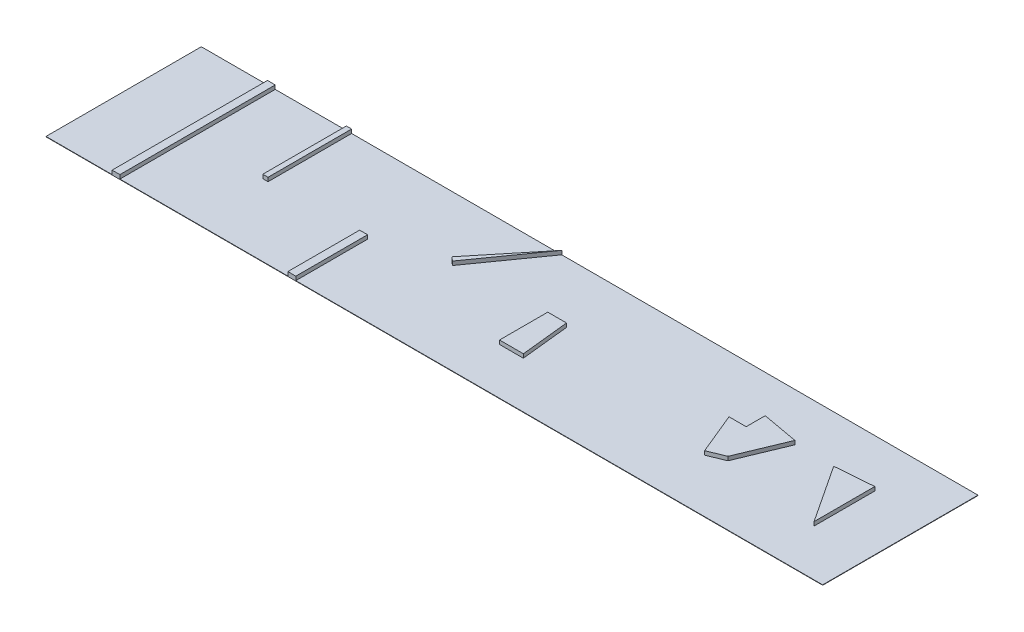
ISO-10303-21;
HEADER;
FILE_DESCRIPTION(('STEP AP214'),'2;1');
FILE_NAME('part.step','',(''),(''),'','','');
FILE_SCHEMA(('AUTOMOTIVE_DESIGN { 1 0 10303 214 1 1 1 1 }'));
ENDSEC;
DATA;
#1=APPLICATION_CONTEXT('core data for automotive mechanical design processes');
#2=APPLICATION_PROTOCOL_DEFINITION('international standard','automotive_design',2000,#1);
#3=PRODUCT_CONTEXT('',#1,'mechanical');
#4=PRODUCT('Part','Part','',(#3));
#5=PRODUCT_RELATED_PRODUCT_CATEGORY('part','',(#4));
#6=PRODUCT_DEFINITION_FORMATION('','',#4);
#7=PRODUCT_DEFINITION_CONTEXT('part definition',#1,'design');
#8=PRODUCT_DEFINITION('design','',#6,#7);
#9=PRODUCT_DEFINITION_SHAPE('','',#8);
#10=(LENGTH_UNIT() NAMED_UNIT(*) SI_UNIT(.MILLI.,.METRE.));
#11=(NAMED_UNIT(*) PLANE_ANGLE_UNIT() SI_UNIT($,.RADIAN.));
#12=(NAMED_UNIT(*) SI_UNIT($,.STERADIAN.) SOLID_ANGLE_UNIT());
#13=UNCERTAINTY_MEASURE_WITH_UNIT(LENGTH_MEASURE(1.E-05),#10,'distance_accuracy_value','');
#14=(GEOMETRIC_REPRESENTATION_CONTEXT(3) GLOBAL_UNCERTAINTY_ASSIGNED_CONTEXT((#13)) GLOBAL_UNIT_ASSIGNED_CONTEXT((#10,
#11,#12)) REPRESENTATION_CONTEXT('',''));
#15=CARTESIAN_POINT('',(0.,0.,0.));
#16=DIRECTION('',(0.,0.,1.));
#17=DIRECTION('',(1.,0.,0.));
#18=AXIS2_PLACEMENT_3D('',#15,#16,#17);
#19=CARTESIAN_POINT('',(0.,5.,0.));
#20=DIRECTION('',(0.,-1.,0.));
#21=DIRECTION('',(0.,0.,-1.));
#22=AXIS2_PLACEMENT_3D('',#19,#20,#21);
#23=PLANE('',#22);
#24=DIRECTION('',(0.,0.,1.));
#25=VECTOR('',#24,1.);
#26=CARTESIAN_POINT('',(7671.56486257291,5.,456.723686309247));
#27=LINE('',#26,#25);
#28=CARTESIAN_POINT('',(7671.56486257291,5.,456.723686309247));
#29=VERTEX_POINT('',#28);
#30=CARTESIAN_POINT('',(7671.56486257291,5.,701.686848023749));
#31=VERTEX_POINT('',#30);
#32=EDGE_CURVE('E260',#29,#31,#27,.T.);
#33=ORIENTED_EDGE('',*,*,#32,.F.);
#34=DIRECTION('',(-0.984268211128272,0.,-0.176680753231217));
#35=VECTOR('',#34,1.);
#36=CARTESIAN_POINT('',(8137.61316567376,5.,540.381539222733));
#37=LINE('',#36,#35);
#38=CARTESIAN_POINT('',(8137.61316567376,5.,540.381539222733));
#39=VERTEX_POINT('',#38);
#40=EDGE_CURVE('E273',#39,#29,#37,.T.);
#41=ORIENTED_EDGE('',*,*,#40,.F.);
#42=DIRECTION('',(0.383817027591733,0.,-0.923409166800204));
#43=VECTOR('',#42,1.);
#44=CARTESIAN_POINT('',(7884.70173577427,5.,1148.85046052906));
#45=LINE('',#44,#43);
#46=CARTESIAN_POINT('',(7884.70173577427,5.,1148.85046052906));
#47=VERTEX_POINT('',#46);
#48=EDGE_CURVE('E292',#47,#39,#45,.T.);
#49=ORIENTED_EDGE('',*,*,#48,.F.);
#50=DIRECTION('',(0.924348506599223,0.,-0.381549260709265));
#51=VECTOR('',#50,1.);
#52=CARTESIAN_POINT('',(7671.56486257291,5.,1236.82833447949));
#53=LINE('',#52,#51);
#54=CARTESIAN_POINT('',(7671.56486257291,5.,1236.82833447949));
#55=VERTEX_POINT('',#54);
#56=EDGE_CURVE('E289',#55,#47,#53,.T.);
#57=ORIENTED_EDGE('',*,*,#56,.F.);
#58=DIRECTION('',(0.381549260709264,0.,0.924348506599223));
#59=VECTOR('',#58,1.);
#60=CARTESIAN_POINT('',(7450.67107946587,5.,701.686848023749));
#61=LINE('',#60,#59);
#62=CARTESIAN_POINT('',(7450.67107946587,5.,701.686848023749));
#63=VERTEX_POINT('',#62);
#64=EDGE_CURVE('E286',#63,#55,#61,.T.);
#65=ORIENTED_EDGE('',*,*,#64,.F.);
#66=DIRECTION('',(-1.,0.,0.));
#67=VECTOR('',#66,1.);
#68=CARTESIAN_POINT('',(7671.56486257291,5.,701.686848023749));
#69=LINE('',#68,#67);
#70=EDGE_CURVE('E263',#31,#63,#69,.T.);
#71=ORIENTED_EDGE('',*,*,#70,.F.);
#72=EDGE_LOOP('',(#33,#41,#49,#57,#65,#71));
#73=FACE_BOUND('',#72,.T.);
#74=DIRECTION('',(0.578892683274416,0.,-0.815403741254201));
#75=VECTOR('',#74,1.);
#76=CARTESIAN_POINT('',(3933.60961483699,5.,745.514979592607));
#77=LINE('',#76,#75);
#78=CARTESIAN_POINT('',(3933.60961483699,5.,745.514979592607));
#79=VERTEX_POINT('',#78);
#80=CARTESIAN_POINT('',(4517.98470242175,5.,-77.6110444177671));
#81=VERTEX_POINT('',#80);
#82=EDGE_CURVE('E347',#79,#81,#77,.T.);
#83=ORIENTED_EDGE('',*,*,#82,.F.);
#84=DIRECTION('',(0.759256602365291,0.,0.650791373455974));
#85=VECTOR('',#84,1.);
#86=CARTESIAN_POINT('',(3882.47679467332,5.,701.686848023749));
#87=LINE('',#86,#85);
#88=CARTESIAN_POINT('',(3882.47679467332,5.,701.686848023749));
#89=VERTEX_POINT('',#88);
#90=EDGE_CURVE('E352',#89,#79,#87,.T.);
#91=ORIENTED_EDGE('',*,*,#90,.F.);
#92=DIRECTION('',(-0.631986335714479,0.,0.774979529710421));
#93=VECTOR('',#92,1.);
#94=CARTESIAN_POINT('',(4517.98470242175,5.,-77.6110444177671));
#95=LINE('',#94,#93);
#96=EDGE_CURVE('E359',#81,#89,#95,.T.);
#97=ORIENTED_EDGE('',*,*,#96,.F.);
#98=DIRECTION('',(-1.,0.,0.));
#99=VECTOR('',#98,1.);
#100=CARTESIAN_POINT('',(-122.80912364946,5.,-77.6110444177671));
#101=LINE('',#100,#99);
#102=CARTESIAN_POINT('',(1812.00339407787,5.,-77.6110444177671));
#103=VERTEX_POINT('',#102);
#104=EDGE_CURVE('E475',#81,#103,#101,.T.);
#105=ORIENTED_EDGE('',*,*,#104,.T.);
#106=DIRECTION('',(0.,0.,-1.));
#107=VECTOR('',#106,1.);
#108=CARTESIAN_POINT('',(1812.00339407787,5.,998.135460163102));
#109=LINE('',#108,#107);
#110=CARTESIAN_POINT('',(1812.00339407787,5.,998.135460163102));
#111=VERTEX_POINT('',#110);
#112=EDGE_CURVE('E407',#111,#103,#109,.T.);
#113=ORIENTED_EDGE('',*,*,#112,.F.);
#114=DIRECTION('',(1.,0.,0.));
#115=VECTOR('',#114,1.);
#116=CARTESIAN_POINT('',(1744.36738857038,5.,998.135460163102));
#117=LINE('',#116,#115);
#118=CARTESIAN_POINT('',(1744.36738857038,5.,998.135460163102));
#119=VERTEX_POINT('',#118);
#120=EDGE_CURVE('E416',#119,#111,#117,.T.);
#121=ORIENTED_EDGE('',*,*,#120,.F.);
#122=DIRECTION('',(0.,0.,1.));
#123=VECTOR('',#122,1.);
#124=CARTESIAN_POINT('',(1744.36738857038,5.,-77.6110444177671));
#125=LINE('',#124,#123);
#126=CARTESIAN_POINT('',(1744.36738857038,5.,-77.6110444177671));
#127=VERTEX_POINT('',#126);
#128=EDGE_CURVE('E402',#127,#119,#125,.T.);
#129=ORIENTED_EDGE('',*,*,#128,.F.);
#130=CARTESIAN_POINT('',(828.754642352808,5.,-77.6110444177671));
#131=VERTEX_POINT('',#130);
#132=EDGE_CURVE('E510',#127,#131,#101,.T.);
#133=ORIENTED_EDGE('',*,*,#132,.T.);
#134=DIRECTION('',(0.,0.,-1.));
#135=VECTOR('',#134,1.);
#136=CARTESIAN_POINT('',(828.754642352808,5.,1922.38895558223));
#137=LINE('',#136,#135);
#138=CARTESIAN_POINT('',(828.754642352808,5.,1922.38895558223));
#139=VERTEX_POINT('',#138);
#140=EDGE_CURVE('E437',#139,#131,#137,.T.);
#141=ORIENTED_EDGE('',*,*,#140,.F.);
#142=DIRECTION('',(1.,0.,0.));
#143=VECTOR('',#142,1.);
#144=CARTESIAN_POINT('',(-122.80912364946,5.,1922.38895558223));
#145=LINE('',#144,#143);
#146=CARTESIAN_POINT('',(2991.30478610656,5.,1922.38895558223));
#147=VERTEX_POINT('',#146);
#148=EDGE_CURVE('E468',#139,#147,#145,.T.);
#149=ORIENTED_EDGE('',*,*,#148,.T.);
#150=DIRECTION('',(0.,0.,1.));
#151=VECTOR('',#150,1.);
#152=CARTESIAN_POINT('',(2991.30478610656,5.,1922.38895558223));
#153=LINE('',#152,#151);
#154=CARTESIAN_POINT('',(2991.30478610656,5.,998.135460163102));
#155=VERTEX_POINT('',#154);
#156=EDGE_CURVE('E377',#155,#147,#153,.T.);
#157=ORIENTED_EDGE('',*,*,#156,.F.);
#158=DIRECTION('',(-1.,0.,0.));
#159=VECTOR('',#158,1.);
#160=CARTESIAN_POINT('',(2991.30478610656,5.,998.135460163102));
#161=LINE('',#160,#159);
#162=CARTESIAN_POINT('',(3093.5704264339,5.,998.135460163102));
#163=VERTEX_POINT('',#162);
#164=EDGE_CURVE('E386',#163,#155,#161,.T.);
#165=ORIENTED_EDGE('',*,*,#164,.F.);
#166=DIRECTION('',(0.,0.,-1.));
#167=VECTOR('',#166,1.);
#168=CARTESIAN_POINT('',(3093.5704264339,5.,998.135460163102));
#169=LINE('',#168,#167);
#170=CARTESIAN_POINT('',(3093.5704264339,5.,1922.38895558223));
#171=VERTEX_POINT('',#170);
#172=EDGE_CURVE('E372',#171,#163,#169,.T.);
#173=ORIENTED_EDGE('',*,*,#172,.F.);
#174=CARTESIAN_POINT('',(9877.19087635054,5.,1922.38895558223));
#175=VERTEX_POINT('',#174);
#176=EDGE_CURVE('E463',#171,#175,#145,.T.);
#177=ORIENTED_EDGE('',*,*,#176,.T.);
#178=DIRECTION('',(0.,0.,-1.));
#179=VECTOR('',#178,1.);
#180=CARTESIAN_POINT('',(9877.19087635054,5.,1922.38895558223));
#181=LINE('',#180,#179);
#182=CARTESIAN_POINT('',(9877.19087635054,5.,-77.6110444177671));
#183=VERTEX_POINT('',#182);
#184=EDGE_CURVE('E467',#175,#183,#181,.T.);
#185=ORIENTED_EDGE('',*,*,#184,.T.);
#186=EDGE_CURVE('E471',#183,#81,#101,.T.);
#187=ORIENTED_EDGE('',*,*,#186,.T.);
#188=EDGE_LOOP('',(#83,#91,#97,#105,#113,#121,#129,#133,#141,#149,#157,#165,#173,#177,#185,#187));
#189=FACE_BOUND('',#188,.T.);
#190=DIRECTION('',(-0.105293769951943,0.,-0.994441160657234));
#191=VECTOR('',#190,1.);
#192=CARTESIAN_POINT('',(5423.76608817813,5.,1322.58537858256));
#193=LINE('',#192,#191);
#194=CARTESIAN_POINT('',(5423.76608817813,5.,1322.58537858256));
#195=VERTEX_POINT('',#194);
#196=CARTESIAN_POINT('',(5358.02389082484,5.,701.686848023749));
#197=VERTEX_POINT('',#196);
#198=EDGE_CURVE('E314',#195,#197,#193,.T.);
#199=ORIENTED_EDGE('',*,*,#198,.F.);
#200=DIRECTION('',(1.,0.,0.));
#201=VECTOR('',#200,1.);
#202=CARTESIAN_POINT('',(5116.96916719613,5.,1322.58537858256));
#203=LINE('',#202,#201);
#204=CARTESIAN_POINT('',(5116.96916719613,5.,1322.58537858256));
#205=VERTEX_POINT('',#204);
#206=EDGE_CURVE('E319',#205,#195,#203,.T.);
#207=ORIENTED_EDGE('',*,*,#206,.F.);
#208=DIRECTION('',(0.,0.,1.));
#209=VECTOR('',#208,1.);
#210=CARTESIAN_POINT('',(5116.96916719613,5.,701.686848023749));
#211=LINE('',#210,#209);
#212=CARTESIAN_POINT('',(5116.96916719613,5.,701.686848023749));
#213=VERTEX_POINT('',#212);
#214=EDGE_CURVE('E331',#213,#205,#211,.T.);
#215=ORIENTED_EDGE('',*,*,#214,.F.);
#216=DIRECTION('',(-1.,0.,0.));
#217=VECTOR('',#216,1.);
#218=CARTESIAN_POINT('',(5358.02389082484,5.,701.686848023749));
#219=LINE('',#218,#217);
#220=EDGE_CURVE('E328',#197,#213,#219,.T.);
#221=ORIENTED_EDGE('',*,*,#220,.F.);
#222=EDGE_LOOP('',(#199,#207,#215,#221));
#223=FACE_BOUND('',#222,.T.);
#224=DIRECTION('',(-0.996885499085346,0.,0.078862549498226));
#225=VECTOR('',#224,1.);
#226=CARTESIAN_POINT('',(8675.89526309959,5.,579.205267166498));
#227=LINE('',#226,#225);
#228=CARTESIAN_POINT('',(9166.65813665397,5.,540.381539222733));
#229=VERTEX_POINT('',#228);
#230=CARTESIAN_POINT('',(8675.89526309959,5.,579.205267166499));
#231=VERTEX_POINT('',#230);
#232=EDGE_CURVE('E259',#229,#231,#227,.T.);
#233=ORIENTED_EDGE('',*,*,#232,.F.);
#234=DIRECTION('',(0.,0.,-1.));
#235=VECTOR('',#234,1.);
#236=CARTESIAN_POINT('',(9166.65813665397,5.,540.381539222733));
#237=LINE('',#236,#235);
#238=CARTESIAN_POINT('',(9166.65813665397,5.,1322.58537858256));
#239=VERTEX_POINT('',#238);
#240=EDGE_CURVE('E52',#239,#229,#237,.T.);
#241=ORIENTED_EDGE('',*,*,#240,.F.);
#242=DIRECTION('',(0.550945427344042,0.,0.834541272849157));
#243=VECTOR('',#242,1.);
#244=CARTESIAN_POINT('',(9166.65813665397,5.,1322.58537858256));
#245=LINE('',#244,#243);
#246=EDGE_CURVE('E48',#231,#239,#245,.T.);
#247=ORIENTED_EDGE('',*,*,#246,.F.);
#248=EDGE_LOOP('',(#233,#241,#247));
#249=FACE_BOUND('',#248,.T.);
#250=ADVANCED_FACE('F33',(#73,#189,#223,#249),#23,.F.);
#251=DIRECTION('',(0.,0.,1.));
#252=VECTOR('',#251,1.);
#253=CARTESIAN_POINT('',(728.754642352808,5.,-77.6110444177671));
#254=LINE('',#253,#252);
#255=CARTESIAN_POINT('',(728.754642352808,5.,-77.6110444177671));
#256=VERTEX_POINT('',#255);
#257=CARTESIAN_POINT('',(728.754642352808,5.,1922.38895558223));
#258=VERTEX_POINT('',#257);
#259=EDGE_CURVE('E432',#256,#258,#254,.T.);
#260=ORIENTED_EDGE('',*,*,#259,.F.);
#261=CARTESIAN_POINT('',(-122.80912364946,5.,-77.6110444177671));
#262=VERTEX_POINT('',#261);
#263=EDGE_CURVE('E470',#256,#262,#101,.T.);
#264=ORIENTED_EDGE('',*,*,#263,.T.);
#265=DIRECTION('',(0.,0.,1.));
#266=VECTOR('',#265,1.);
#267=CARTESIAN_POINT('',(-122.80912364946,5.,1922.38895558223));
#268=LINE('',#267,#266);
#269=CARTESIAN_POINT('',(-122.80912364946,5.,1922.38895558223));
#270=VERTEX_POINT('',#269);
#271=EDGE_CURVE('E460',#262,#270,#268,.T.);
#272=ORIENTED_EDGE('',*,*,#271,.T.);
#273=EDGE_CURVE('E465',#270,#258,#145,.T.);
#274=ORIENTED_EDGE('',*,*,#273,.T.);
#275=EDGE_LOOP('',(#260,#264,#272,#274));
#276=FACE_BOUND('',#275,.T.);
#277=ADVANCED_FACE('F508',(#276),#23,.F.);
#278=CARTESIAN_POINT('',(-122.80912364946,5.,1922.38895558223));
#279=DIRECTION('',(1.,0.,0.));
#280=DIRECTION('',(0.,0.,-1.));
#281=AXIS2_PLACEMENT_3D('',#278,#279,#280);
#282=PLANE('',#281);
#283=DIRECTION('',(0.,0.,1.));
#284=VECTOR('',#283,1.);
#285=CARTESIAN_POINT('',(-122.80912364946,0.,1922.38895558223));
#286=LINE('',#285,#284);
#287=CARTESIAN_POINT('',(-122.80912364946,0.,-77.6110444177671));
#288=VERTEX_POINT('',#287);
#289=CARTESIAN_POINT('',(-122.80912364946,0.,1922.38895558223));
#290=VERTEX_POINT('',#289);
#291=EDGE_CURVE('E459',#288,#290,#286,.T.);
#292=ORIENTED_EDGE('',*,*,#291,.T.);
#293=DIRECTION('',(0.,-1.,0.));
#294=VECTOR('',#293,1.);
#295=CARTESIAN_POINT('',(-122.80912364946,5.,1922.38895558223));
#296=LINE('',#295,#294);
#297=EDGE_CURVE('E11',#270,#290,#296,.T.);
#298=ORIENTED_EDGE('',*,*,#297,.F.);
#299=ORIENTED_EDGE('',*,*,#271,.F.);
#300=DIRECTION('',(0.,-1.,0.));
#301=VECTOR('',#300,1.);
#302=CARTESIAN_POINT('',(-122.80912364946,5.,-77.6110444177671));
#303=LINE('',#302,#301);
#304=EDGE_CURVE('E474',#262,#288,#303,.T.);
#305=ORIENTED_EDGE('',*,*,#304,.T.);
#306=EDGE_LOOP('',(#292,#298,#299,#305));
#307=FACE_BOUND('',#306,.T.);
#308=ADVANCED_FACE('F35',(#307),#282,.F.);
#309=CARTESIAN_POINT('',(-122.80912364946,5.,1922.38895558223));
#310=DIRECTION('',(0.,0.,-1.));
#311=DIRECTION('',(-1.,0.,0.));
#312=AXIS2_PLACEMENT_3D('',#309,#310,#311);
#313=PLANE('',#312);
#314=DIRECTION('',(1.,0.,0.));
#315=VECTOR('',#314,1.);
#316=CARTESIAN_POINT('',(-122.80912364946,0.,1922.38895558223));
#317=LINE('',#316,#315);
#318=CARTESIAN_POINT('',(9877.19087635054,0.,1922.38895558223));
#319=VERTEX_POINT('',#318);
#320=EDGE_CURVE('E478',#290,#319,#317,.T.);
#321=ORIENTED_EDGE('',*,*,#320,.T.);
#322=DIRECTION('',(0.,-1.,0.));
#323=VECTOR('',#322,1.);
#324=CARTESIAN_POINT('',(9877.19087635054,5.,1922.38895558223));
#325=LINE('',#324,#323);
#326=EDGE_CURVE('E41',#175,#319,#325,.T.);
#327=ORIENTED_EDGE('',*,*,#326,.F.);
#328=ORIENTED_EDGE('',*,*,#176,.F.);
#329=DIRECTION('',(0.,-1.,0.));
#330=VECTOR('',#329,1.);
#331=CARTESIAN_POINT('',(3093.5704264339,55.,1922.38895558223));
#332=LINE('',#331,#330);
#333=CARTESIAN_POINT('',(3093.5704264339,55.,1922.38895558223));
#334=VERTEX_POINT('',#333);
#335=EDGE_CURVE('E399',#334,#171,#332,.T.);
#336=ORIENTED_EDGE('',*,*,#335,.F.);
#337=DIRECTION('',(1.,0.,0.));
#338=VECTOR('',#337,1.);
#339=CARTESIAN_POINT('',(3093.5704264339,55.,1922.38895558223));
#340=LINE('',#339,#338);
#341=CARTESIAN_POINT('',(2991.30478610656,55.,1922.38895558223));
#342=VERTEX_POINT('',#341);
#343=EDGE_CURVE('E373',#342,#334,#340,.T.);
#344=ORIENTED_EDGE('',*,*,#343,.F.);
#345=DIRECTION('',(0.,-1.,0.));
#346=VECTOR('',#345,1.);
#347=CARTESIAN_POINT('',(2991.30478610656,55.,1922.38895558223));
#348=LINE('',#347,#346);
#349=EDGE_CURVE('E383',#342,#147,#348,.T.);
#350=ORIENTED_EDGE('',*,*,#349,.T.);
#351=ORIENTED_EDGE('',*,*,#148,.F.);
#352=DIRECTION('',(0.,-1.,0.));
#353=VECTOR('',#352,1.);
#354=CARTESIAN_POINT('',(828.754642352808,55.,1922.38895558223));
#355=LINE('',#354,#353);
#356=CARTESIAN_POINT('',(828.754642352808,55.,1922.38895558223));
#357=VERTEX_POINT('',#356);
#358=EDGE_CURVE('E450',#357,#139,#355,.T.);
#359=ORIENTED_EDGE('',*,*,#358,.F.);
#360=DIRECTION('',(1.,0.,0.));
#361=VECTOR('',#360,1.);
#362=CARTESIAN_POINT('',(728.754642352808,55.,1922.38895558223));
#363=LINE('',#362,#361);
#364=CARTESIAN_POINT('',(728.754642352808,55.,1922.38895558223));
#365=VERTEX_POINT('',#364);
#366=EDGE_CURVE('E439',#365,#357,#363,.T.);
#367=ORIENTED_EDGE('',*,*,#366,.F.);
#368=DIRECTION('',(0.,-1.,0.));
#369=VECTOR('',#368,1.);
#370=CARTESIAN_POINT('',(728.754642352808,55.,1922.38895558223));
#371=LINE('',#370,#369);
#372=EDGE_CURVE('E453',#365,#258,#371,.T.);
#373=ORIENTED_EDGE('',*,*,#372,.T.);
#374=ORIENTED_EDGE('',*,*,#273,.F.);
#375=ORIENTED_EDGE('',*,*,#297,.T.);
#376=EDGE_LOOP('',(#321,#327,#328,#336,#344,#350,#351,#359,#367,#373,#374,#375));
#377=FACE_BOUND('',#376,.T.);
#378=ADVANCED_FACE('F556',(#377),#313,.F.);
#379=CARTESIAN_POINT('',(9877.19087635054,5.,1922.38895558223));
#380=DIRECTION('',(-1.,0.,0.));
#381=DIRECTION('',(0.,0.,1.));
#382=AXIS2_PLACEMENT_3D('',#379,#380,#381);
#383=PLANE('',#382);
#384=DIRECTION('',(0.,0.,-1.));
#385=VECTOR('',#384,1.);
#386=CARTESIAN_POINT('',(9877.19087635054,0.,1922.38895558223));
#387=LINE('',#386,#385);
#388=CARTESIAN_POINT('',(9877.19087635054,0.,-77.6110444177671));
#389=VERTEX_POINT('',#388);
#390=EDGE_CURVE('E480',#319,#389,#387,.T.);
#391=ORIENTED_EDGE('',*,*,#390,.T.);
#392=DIRECTION('',(0.,-1.,0.));
#393=VECTOR('',#392,1.);
#394=CARTESIAN_POINT('',(9877.19087635054,5.,-77.6110444177671));
#395=LINE('',#394,#393);
#396=EDGE_CURVE('E485',#183,#389,#395,.T.);
#397=ORIENTED_EDGE('',*,*,#396,.F.);
#398=ORIENTED_EDGE('',*,*,#184,.F.);
#399=ORIENTED_EDGE('',*,*,#326,.T.);
#400=EDGE_LOOP('',(#391,#397,#398,#399));
#401=FACE_BOUND('',#400,.T.);
#402=ADVANCED_FACE('F492',(#401),#383,.F.);
#403=CARTESIAN_POINT('',(-122.80912364946,5.,-77.6110444177671));
#404=DIRECTION('',(0.,0.,1.));
#405=DIRECTION('',(1.,0.,0.));
#406=AXIS2_PLACEMENT_3D('',#403,#404,#405);
#407=PLANE('',#406);
#408=DIRECTION('',(-1.,0.,0.));
#409=VECTOR('',#408,1.);
#410=CARTESIAN_POINT('',(-122.80912364946,0.,-77.6110444177671));
#411=LINE('',#410,#409);
#412=EDGE_CURVE('E464',#389,#288,#411,.T.);
#413=ORIENTED_EDGE('',*,*,#412,.T.);
#414=ORIENTED_EDGE('',*,*,#304,.F.);
#415=ORIENTED_EDGE('',*,*,#263,.F.);
#416=DIRECTION('',(0.,-1.,0.));
#417=VECTOR('',#416,1.);
#418=CARTESIAN_POINT('',(728.754642352808,55.,-77.6110444177671));
#419=LINE('',#418,#417);
#420=CARTESIAN_POINT('',(728.754642352808,55.,-77.6110444177671));
#421=VERTEX_POINT('',#420);
#422=EDGE_CURVE('E456',#421,#256,#419,.T.);
#423=ORIENTED_EDGE('',*,*,#422,.F.);
#424=DIRECTION('',(-1.,0.,0.));
#425=VECTOR('',#424,1.);
#426=CARTESIAN_POINT('',(828.754642352808,55.,-77.6110444177671));
#427=LINE('',#426,#425);
#428=CARTESIAN_POINT('',(828.754642352808,55.,-77.6110444177671));
#429=VERTEX_POINT('',#428);
#430=EDGE_CURVE('E433',#429,#421,#427,.T.);
#431=ORIENTED_EDGE('',*,*,#430,.F.);
#432=DIRECTION('',(0.,-1.,0.));
#433=VECTOR('',#432,1.);
#434=CARTESIAN_POINT('',(828.754642352808,55.,-77.6110444177671));
#435=LINE('',#434,#433);
#436=EDGE_CURVE('E443',#429,#131,#435,.T.);
#437=ORIENTED_EDGE('',*,*,#436,.T.);
#438=ORIENTED_EDGE('',*,*,#132,.F.);
#439=DIRECTION('',(0.,-1.,0.));
#440=VECTOR('',#439,1.);
#441=CARTESIAN_POINT('',(1744.36738857038,55.,-77.6110444177671));
#442=LINE('',#441,#440);
#443=CARTESIAN_POINT('',(1744.36738857038,55.,-77.6110444177671));
#444=VERTEX_POINT('',#443);
#445=EDGE_CURVE('E429',#444,#127,#442,.T.);
#446=ORIENTED_EDGE('',*,*,#445,.F.);
#447=DIRECTION('',(-1.,0.,0.));
#448=VECTOR('',#447,1.);
#449=CARTESIAN_POINT('',(1812.00339407787,55.,-77.6110444177671));
#450=LINE('',#449,#448);
#451=CARTESIAN_POINT('',(1812.00339407787,55.,-77.6110444177671));
#452=VERTEX_POINT('',#451);
#453=EDGE_CURVE('E403',#452,#444,#450,.T.);
#454=ORIENTED_EDGE('',*,*,#453,.F.);
#455=DIRECTION('',(0.,-1.,0.));
#456=VECTOR('',#455,1.);
#457=CARTESIAN_POINT('',(1812.00339407787,55.,-77.6110444177671));
#458=LINE('',#457,#456);
#459=EDGE_CURVE('E413',#452,#103,#458,.T.);
#460=ORIENTED_EDGE('',*,*,#459,.T.);
#461=ORIENTED_EDGE('',*,*,#104,.F.);
#462=ORIENTED_EDGE('',*,*,#186,.F.);
#463=ORIENTED_EDGE('',*,*,#396,.T.);
#464=EDGE_LOOP('',(#413,#414,#415,#423,#431,#437,#438,#446,#454,#460,#461,#462,#463));
#465=FACE_BOUND('',#464,.T.);
#466=ADVANCED_FACE('F501',(#465),#407,.F.);
#467=CARTESIAN_POINT('',(0.,0.,0.));
#468=DIRECTION('',(0.,-1.,0.));
#469=DIRECTION('',(0.,0.,-1.));
#470=AXIS2_PLACEMENT_3D('',#467,#468,#469);
#471=PLANE('',#470);
#472=ORIENTED_EDGE('',*,*,#291,.F.);
#473=ORIENTED_EDGE('',*,*,#412,.F.);
#474=ORIENTED_EDGE('',*,*,#390,.F.);
#475=ORIENTED_EDGE('',*,*,#320,.F.);
#476=EDGE_LOOP('',(#472,#473,#474,#475));
#477=FACE_BOUND('',#476,.T.);
#478=ADVANCED_FACE('F498',(#477),#471,.T.);
#479=CARTESIAN_POINT('',(728.754642352808,55.,-77.6110444177671));
#480=DIRECTION('',(1.,0.,0.));
#481=DIRECTION('',(0.,0.,-1.));
#482=AXIS2_PLACEMENT_3D('',#479,#480,#481);
#483=PLANE('',#482);
#484=ORIENTED_EDGE('',*,*,#259,.T.);
#485=ORIENTED_EDGE('',*,*,#372,.F.);
#486=DIRECTION('',(0.,0.,1.));
#487=VECTOR('',#486,1.);
#488=CARTESIAN_POINT('',(728.754642352808,55.,-77.6110444177671));
#489=LINE('',#488,#487);
#490=EDGE_CURVE('E436',#421,#365,#489,.T.);
#491=ORIENTED_EDGE('',*,*,#490,.F.);
#492=ORIENTED_EDGE('',*,*,#422,.T.);
#493=EDGE_LOOP('',(#484,#485,#491,#492));
#494=FACE_BOUND('',#493,.T.);
#495=ADVANCED_FACE('F549',(#494),#483,.F.);
#496=CARTESIAN_POINT('',(828.754642352808,55.,1922.38895558223));
#497=DIRECTION('',(-1.,0.,0.));
#498=DIRECTION('',(0.,0.,1.));
#499=AXIS2_PLACEMENT_3D('',#496,#497,#498);
#500=PLANE('',#499);
#501=ORIENTED_EDGE('',*,*,#140,.T.);
#502=ORIENTED_EDGE('',*,*,#436,.F.);
#503=DIRECTION('',(0.,0.,-1.));
#504=VECTOR('',#503,1.);
#505=CARTESIAN_POINT('',(828.754642352808,55.,1922.38895558223));
#506=LINE('',#505,#504);
#507=EDGE_CURVE('E441',#357,#429,#506,.T.);
#508=ORIENTED_EDGE('',*,*,#507,.F.);
#509=ORIENTED_EDGE('',*,*,#358,.T.);
#510=EDGE_LOOP('',(#501,#502,#508,#509));
#511=FACE_BOUND('',#510,.T.);
#512=ADVANCED_FACE('F538',(#511),#500,.F.);
#513=CARTESIAN_POINT('',(0.,55.,0.));
#514=DIRECTION('',(0.,1.,0.));
#515=DIRECTION('',(0.,0.,1.));
#516=AXIS2_PLACEMENT_3D('',#513,#514,#515);
#517=PLANE('',#516);
#518=ORIENTED_EDGE('',*,*,#430,.T.);
#519=ORIENTED_EDGE('',*,*,#490,.T.);
#520=ORIENTED_EDGE('',*,*,#366,.T.);
#521=ORIENTED_EDGE('',*,*,#507,.T.);
#522=EDGE_LOOP('',(#518,#519,#520,#521));
#523=FACE_BOUND('',#522,.T.);
#524=ADVANCED_FACE('F531',(#523),#517,.T.);
#525=CARTESIAN_POINT('',(1744.36738857038,55.,-77.6110444177671));
#526=DIRECTION('',(1.,0.,0.));
#527=DIRECTION('',(0.,0.,-1.));
#528=AXIS2_PLACEMENT_3D('',#525,#526,#527);
#529=PLANE('',#528);
#530=ORIENTED_EDGE('',*,*,#128,.T.);
#531=DIRECTION('',(0.,-1.,0.));
#532=VECTOR('',#531,1.);
#533=CARTESIAN_POINT('',(1744.36738857038,55.,998.135460163102));
#534=LINE('',#533,#532);
#535=CARTESIAN_POINT('',(1744.36738857038,55.,998.135460163102));
#536=VERTEX_POINT('',#535);
#537=EDGE_CURVE('E426',#536,#119,#534,.T.);
#538=ORIENTED_EDGE('',*,*,#537,.F.);
#539=DIRECTION('',(0.,0.,1.));
#540=VECTOR('',#539,1.);
#541=CARTESIAN_POINT('',(1744.36738857038,55.,-77.6110444177671));
#542=LINE('',#541,#540);
#543=EDGE_CURVE('E406',#444,#536,#542,.T.);
#544=ORIENTED_EDGE('',*,*,#543,.F.);
#545=ORIENTED_EDGE('',*,*,#445,.T.);
#546=EDGE_LOOP('',(#530,#538,#544,#545));
#547=FACE_BOUND('',#546,.T.);
#548=ADVANCED_FACE('F529',(#547),#529,.F.);
#549=CARTESIAN_POINT('',(1744.36738857038,55.,998.135460163102));
#550=DIRECTION('',(0.,0.,-1.));
#551=DIRECTION('',(-1.,0.,0.));
#552=AXIS2_PLACEMENT_3D('',#549,#550,#551);
#553=PLANE('',#552);
#554=ORIENTED_EDGE('',*,*,#120,.T.);
#555=DIRECTION('',(0.,-1.,0.));
#556=VECTOR('',#555,1.);
#557=CARTESIAN_POINT('',(1812.00339407787,55.,998.135460163102));
#558=LINE('',#557,#556);
#559=CARTESIAN_POINT('',(1812.00339407787,55.,998.135460163102));
#560=VERTEX_POINT('',#559);
#561=EDGE_CURVE('E423',#560,#111,#558,.T.);
#562=ORIENTED_EDGE('',*,*,#561,.F.);
#563=DIRECTION('',(1.,0.,0.));
#564=VECTOR('',#563,1.);
#565=CARTESIAN_POINT('',(1744.36738857038,55.,998.135460163102));
#566=LINE('',#565,#564);
#567=EDGE_CURVE('E409',#536,#560,#566,.T.);
#568=ORIENTED_EDGE('',*,*,#567,.F.);
#569=ORIENTED_EDGE('',*,*,#537,.T.);
#570=EDGE_LOOP('',(#554,#562,#568,#569));
#571=FACE_BOUND('',#570,.T.);
#572=ADVANCED_FACE('F527',(#571),#553,.F.);
#573=CARTESIAN_POINT('',(1812.00339407787,55.,998.135460163102));
#574=DIRECTION('',(-1.,0.,0.));
#575=DIRECTION('',(0.,0.,1.));
#576=AXIS2_PLACEMENT_3D('',#573,#574,#575);
#577=PLANE('',#576);
#578=ORIENTED_EDGE('',*,*,#112,.T.);
#579=ORIENTED_EDGE('',*,*,#459,.F.);
#580=DIRECTION('',(0.,0.,-1.));
#581=VECTOR('',#580,1.);
#582=CARTESIAN_POINT('',(1812.00339407787,55.,998.135460163102));
#583=LINE('',#582,#581);
#584=EDGE_CURVE('E411',#560,#452,#583,.T.);
#585=ORIENTED_EDGE('',*,*,#584,.F.);
#586=ORIENTED_EDGE('',*,*,#561,.T.);
#587=EDGE_LOOP('',(#578,#579,#585,#586));
#588=FACE_BOUND('',#587,.T.);
#589=ADVANCED_FACE('F517',(#588),#577,.F.);
#590=CARTESIAN_POINT('',(0.,55.,0.));
#591=DIRECTION('',(0.,1.,0.));
#592=DIRECTION('',(0.,0.,1.));
#593=AXIS2_PLACEMENT_3D('',#590,#591,#592);
#594=PLANE('',#593);
#595=ORIENTED_EDGE('',*,*,#453,.T.);
#596=ORIENTED_EDGE('',*,*,#543,.T.);
#597=ORIENTED_EDGE('',*,*,#567,.T.);
#598=ORIENTED_EDGE('',*,*,#584,.T.);
#599=EDGE_LOOP('',(#595,#596,#597,#598));
#600=FACE_BOUND('',#599,.T.);
#601=ADVANCED_FACE('F523',(#600),#594,.T.);
#602=CARTESIAN_POINT('',(3093.5704264339,55.,998.135460163102));
#603=DIRECTION('',(-1.,0.,0.));
#604=DIRECTION('',(0.,0.,1.));
#605=AXIS2_PLACEMENT_3D('',#602,#603,#604);
#606=PLANE('',#605);
#607=ORIENTED_EDGE('',*,*,#172,.T.);
#608=DIRECTION('',(0.,-1.,0.));
#609=VECTOR('',#608,1.);
#610=CARTESIAN_POINT('',(3093.5704264339,55.,998.135460163102));
#611=LINE('',#610,#609);
#612=CARTESIAN_POINT('',(3093.5704264339,55.,998.135460163102));
#613=VERTEX_POINT('',#612);
#614=EDGE_CURVE('E396',#613,#163,#611,.T.);
#615=ORIENTED_EDGE('',*,*,#614,.F.);
#616=DIRECTION('',(0.,0.,-1.));
#617=VECTOR('',#616,1.);
#618=CARTESIAN_POINT('',(3093.5704264339,55.,998.135460163102));
#619=LINE('',#618,#617);
#620=EDGE_CURVE('E376',#334,#613,#619,.T.);
#621=ORIENTED_EDGE('',*,*,#620,.F.);
#622=ORIENTED_EDGE('',*,*,#335,.T.);
#623=EDGE_LOOP('',(#607,#615,#621,#622));
#624=FACE_BOUND('',#623,.T.);
#625=ADVANCED_FACE('F575',(#624),#606,.F.);
#626=CARTESIAN_POINT('',(2991.30478610656,55.,998.135460163102));
#627=DIRECTION('',(0.,0.,1.));
#628=DIRECTION('',(1.,0.,0.));
#629=AXIS2_PLACEMENT_3D('',#626,#627,#628);
#630=PLANE('',#629);
#631=ORIENTED_EDGE('',*,*,#164,.T.);
#632=DIRECTION('',(0.,-1.,0.));
#633=VECTOR('',#632,1.);
#634=CARTESIAN_POINT('',(2991.30478610656,55.,998.135460163102));
#635=LINE('',#634,#633);
#636=CARTESIAN_POINT('',(2991.30478610656,55.,998.135460163102));
#637=VERTEX_POINT('',#636);
#638=EDGE_CURVE('E393',#637,#155,#635,.T.);
#639=ORIENTED_EDGE('',*,*,#638,.F.);
#640=DIRECTION('',(-1.,0.,0.));
#641=VECTOR('',#640,1.);
#642=CARTESIAN_POINT('',(2991.30478610656,55.,998.135460163102));
#643=LINE('',#642,#641);
#644=EDGE_CURVE('E379',#613,#637,#643,.T.);
#645=ORIENTED_EDGE('',*,*,#644,.F.);
#646=ORIENTED_EDGE('',*,*,#614,.T.);
#647=EDGE_LOOP('',(#631,#639,#645,#646));
#648=FACE_BOUND('',#647,.T.);
#649=ADVANCED_FACE('F585',(#648),#630,.F.);
#650=CARTESIAN_POINT('',(2991.30478610656,55.,1922.38895558223));
#651=DIRECTION('',(1.,0.,0.));
#652=DIRECTION('',(0.,0.,-1.));
#653=AXIS2_PLACEMENT_3D('',#650,#651,#652);
#654=PLANE('',#653);
#655=ORIENTED_EDGE('',*,*,#156,.T.);
#656=ORIENTED_EDGE('',*,*,#349,.F.);
#657=DIRECTION('',(0.,0.,1.));
#658=VECTOR('',#657,1.);
#659=CARTESIAN_POINT('',(2991.30478610656,55.,1922.38895558223));
#660=LINE('',#659,#658);
#661=EDGE_CURVE('E381',#637,#342,#660,.T.);
#662=ORIENTED_EDGE('',*,*,#661,.F.);
#663=ORIENTED_EDGE('',*,*,#638,.T.);
#664=EDGE_LOOP('',(#655,#656,#662,#663));
#665=FACE_BOUND('',#664,.T.);
#666=ADVANCED_FACE('F583',(#665),#654,.F.);
#667=CARTESIAN_POINT('',(0.,55.,0.));
#668=DIRECTION('',(0.,-1.,0.));
#669=DIRECTION('',(0.,0.,-1.));
#670=AXIS2_PLACEMENT_3D('',#667,#668,#669);
#671=PLANE('',#670);
#672=ORIENTED_EDGE('',*,*,#343,.T.);
#673=ORIENTED_EDGE('',*,*,#620,.T.);
#674=ORIENTED_EDGE('',*,*,#644,.T.);
#675=ORIENTED_EDGE('',*,*,#661,.T.);
#676=EDGE_LOOP('',(#672,#673,#674,#675));
#677=FACE_BOUND('',#676,.T.);
#678=ADVANCED_FACE('F579',(#677),#671,.F.);
#679=CARTESIAN_POINT('',(3933.60961483699,55.,745.514979592607));
#680=DIRECTION('',(-0.815403741254201,0.,-0.578892683274416));
#681=DIRECTION('',(-0.578892683274416,0.,0.815403741254201));
#682=AXIS2_PLACEMENT_3D('',#679,#680,#681);
#683=PLANE('',#682);
#684=ORIENTED_EDGE('',*,*,#82,.T.);
#685=DIRECTION('',(0.,-1.,0.));
#686=VECTOR('',#685,1.);
#687=CARTESIAN_POINT('',(4517.98470242175,55.,-77.6110444177671));
#688=LINE('',#687,#686);
#689=CARTESIAN_POINT('',(4517.98470242175,55.,-77.6110444177671));
#690=VERTEX_POINT('',#689);
#691=EDGE_CURVE('E369',#690,#81,#688,.T.);
#692=ORIENTED_EDGE('',*,*,#691,.F.);
#693=DIRECTION('',(0.578892683274416,0.,-0.815403741254201));
#694=VECTOR('',#693,1.);
#695=CARTESIAN_POINT('',(3933.60961483699,55.,745.514979592607));
#696=LINE('',#695,#694);
#697=CARTESIAN_POINT('',(3933.60961483699,55.,745.514979592607));
#698=VERTEX_POINT('',#697);
#699=EDGE_CURVE('E348',#698,#690,#696,.T.);
#700=ORIENTED_EDGE('',*,*,#699,.F.);
#701=DIRECTION('',(0.,-1.,0.));
#702=VECTOR('',#701,1.);
#703=CARTESIAN_POINT('',(3933.60961483699,55.,745.514979592607));
#704=LINE('',#703,#702);
#705=EDGE_CURVE('E356',#698,#79,#704,.T.);
#706=ORIENTED_EDGE('',*,*,#705,.T.);
#707=EDGE_LOOP('',(#684,#692,#700,#706));
#708=FACE_BOUND('',#707,.T.);
#709=ADVANCED_FACE('F630',(#708),#683,.F.);
#710=CARTESIAN_POINT('',(4517.98470242175,55.,-77.6110444177671));
#711=DIRECTION('',(0.774979529710421,0.,0.631986335714479));
#712=DIRECTION('',(0.631986335714479,0.,-0.774979529710421));
#713=AXIS2_PLACEMENT_3D('',#710,#711,#712);
#714=PLANE('',#713);
#715=ORIENTED_EDGE('',*,*,#96,.T.);
#716=DIRECTION('',(0.,-1.,0.));
#717=VECTOR('',#716,1.);
#718=CARTESIAN_POINT('',(3882.47679467332,55.,701.686848023749));
#719=LINE('',#718,#717);
#720=CARTESIAN_POINT('',(3882.47679467332,55.,701.686848023749));
#721=VERTEX_POINT('',#720);
#722=EDGE_CURVE('E366',#721,#89,#719,.T.);
#723=ORIENTED_EDGE('',*,*,#722,.F.);
#724=DIRECTION('',(-0.631986335714479,0.,0.774979529710421));
#725=VECTOR('',#724,1.);
#726=CARTESIAN_POINT('',(4517.98470242175,55.,-77.6110444177671));
#727=LINE('',#726,#725);
#728=EDGE_CURVE('E351',#690,#721,#727,.T.);
#729=ORIENTED_EDGE('',*,*,#728,.F.);
#730=ORIENTED_EDGE('',*,*,#691,.T.);
#731=EDGE_LOOP('',(#715,#723,#729,#730));
#732=FACE_BOUND('',#731,.T.);
#733=ADVANCED_FACE('F638',(#732),#714,.F.);
#734=CARTESIAN_POINT('',(3882.47679467332,55.,701.686848023749));
#735=DIRECTION('',(0.650791373455974,0.,-0.759256602365291));
#736=DIRECTION('',(-0.759256602365291,0.,-0.650791373455974));
#737=AXIS2_PLACEMENT_3D('',#734,#735,#736);
#738=PLANE('',#737);
#739=ORIENTED_EDGE('',*,*,#90,.T.);
#740=ORIENTED_EDGE('',*,*,#705,.F.);
#741=DIRECTION('',(0.759256602365291,0.,0.650791373455974));
#742=VECTOR('',#741,1.);
#743=CARTESIAN_POINT('',(3882.47679467332,55.,701.686848023749));
#744=LINE('',#743,#742);
#745=EDGE_CURVE('E354',#721,#698,#744,.T.);
#746=ORIENTED_EDGE('',*,*,#745,.F.);
#747=ORIENTED_EDGE('',*,*,#722,.T.);
#748=EDGE_LOOP('',(#739,#740,#746,#747));
#749=FACE_BOUND('',#748,.T.);
#750=ADVANCED_FACE('F648',(#749),#738,.F.);
#751=CARTESIAN_POINT('',(0.,55.,0.));
#752=DIRECTION('',(0.,-1.,0.));
#753=DIRECTION('',(0.,0.,-1.));
#754=AXIS2_PLACEMENT_3D('',#751,#752,#753);
#755=PLANE('',#754);
#756=ORIENTED_EDGE('',*,*,#699,.T.);
#757=ORIENTED_EDGE('',*,*,#728,.T.);
#758=ORIENTED_EDGE('',*,*,#745,.T.);
#759=EDGE_LOOP('',(#756,#757,#758));
#760=FACE_BOUND('',#759,.T.);
#761=ADVANCED_FACE('F658',(#760),#755,.F.);
#762=CARTESIAN_POINT('',(5423.76608817813,55.,1322.58537858256));
#763=DIRECTION('',(-0.994441160657234,0.,0.105293769951943));
#764=DIRECTION('',(0.105293769951943,0.,0.994441160657234));
#765=AXIS2_PLACEMENT_3D('',#762,#763,#764);
#766=PLANE('',#765);
#767=ORIENTED_EDGE('',*,*,#198,.T.);
#768=DIRECTION('',(0.,-1.,0.));
#769=VECTOR('',#768,1.);
#770=CARTESIAN_POINT('',(5358.02389082484,55.,701.686848023749));
#771=LINE('',#770,#769);
#772=CARTESIAN_POINT('',(5358.02389082484,55.,701.686848023749));
#773=VERTEX_POINT('',#772);
#774=EDGE_CURVE('E344',#773,#197,#771,.T.);
#775=ORIENTED_EDGE('',*,*,#774,.F.);
#776=DIRECTION('',(-0.105293769951943,0.,-0.994441160657234));
#777=VECTOR('',#776,1.);
#778=CARTESIAN_POINT('',(5423.76608817813,55.,1322.58537858256));
#779=LINE('',#778,#777);
#780=CARTESIAN_POINT('',(5423.76608817813,55.,1322.58537858256));
#781=VERTEX_POINT('',#780);
#782=EDGE_CURVE('E315',#781,#773,#779,.T.);
#783=ORIENTED_EDGE('',*,*,#782,.F.);
#784=DIRECTION('',(0.,-1.,0.));
#785=VECTOR('',#784,1.);
#786=CARTESIAN_POINT('',(5423.76608817813,55.,1322.58537858256));
#787=LINE('',#786,#785);
#788=EDGE_CURVE('E325',#781,#195,#787,.T.);
#789=ORIENTED_EDGE('',*,*,#788,.T.);
#790=EDGE_LOOP('',(#767,#775,#783,#789));
#791=FACE_BOUND('',#790,.T.);
#792=ADVANCED_FACE('F668',(#791),#766,.F.);
#793=CARTESIAN_POINT('',(5358.02389082484,55.,701.686848023749));
#794=DIRECTION('',(0.,0.,1.));
#795=DIRECTION('',(1.,0.,0.));
#796=AXIS2_PLACEMENT_3D('',#793,#794,#795);
#797=PLANE('',#796);
#798=ORIENTED_EDGE('',*,*,#220,.T.);
#799=DIRECTION('',(0.,-1.,0.));
#800=VECTOR('',#799,1.);
#801=CARTESIAN_POINT('',(5116.96916719613,55.,701.686848023749));
#802=LINE('',#801,#800);
#803=CARTESIAN_POINT('',(5116.96916719613,55.,701.686848023749));
#804=VERTEX_POINT('',#803);
#805=EDGE_CURVE('E341',#804,#213,#802,.T.);
#806=ORIENTED_EDGE('',*,*,#805,.F.);
#807=DIRECTION('',(-1.,0.,0.));
#808=VECTOR('',#807,1.);
#809=CARTESIAN_POINT('',(5358.02389082484,55.,701.686848023749));
#810=LINE('',#809,#808);
#811=EDGE_CURVE('E318',#773,#804,#810,.T.);
#812=ORIENTED_EDGE('',*,*,#811,.F.);
#813=ORIENTED_EDGE('',*,*,#774,.T.);
#814=EDGE_LOOP('',(#798,#806,#812,#813));
#815=FACE_BOUND('',#814,.T.);
#816=ADVANCED_FACE('F678',(#815),#797,.F.);
#817=CARTESIAN_POINT('',(5116.96916719613,55.,701.686848023749));
#818=DIRECTION('',(1.,0.,0.));
#819=DIRECTION('',(0.,0.,-1.));
#820=AXIS2_PLACEMENT_3D('',#817,#818,#819);
#821=PLANE('',#820);
#822=ORIENTED_EDGE('',*,*,#214,.T.);
#823=DIRECTION('',(0.,-1.,0.));
#824=VECTOR('',#823,1.);
#825=CARTESIAN_POINT('',(5116.96916719613,55.,1322.58537858256));
#826=LINE('',#825,#824);
#827=CARTESIAN_POINT('',(5116.96916719613,55.,1322.58537858256));
#828=VERTEX_POINT('',#827);
#829=EDGE_CURVE('E338',#828,#205,#826,.T.);
#830=ORIENTED_EDGE('',*,*,#829,.F.);
#831=DIRECTION('',(0.,0.,1.));
#832=VECTOR('',#831,1.);
#833=CARTESIAN_POINT('',(5116.96916719613,55.,701.686848023749));
#834=LINE('',#833,#832);
#835=EDGE_CURVE('E321',#804,#828,#834,.T.);
#836=ORIENTED_EDGE('',*,*,#835,.F.);
#837=ORIENTED_EDGE('',*,*,#805,.T.);
#838=EDGE_LOOP('',(#822,#830,#836,#837));
#839=FACE_BOUND('',#838,.T.);
#840=ADVANCED_FACE('F688',(#839),#821,.F.);
#841=CARTESIAN_POINT('',(5116.96916719613,55.,1322.58537858256));
#842=DIRECTION('',(0.,0.,-1.));
#843=DIRECTION('',(-1.,0.,0.));
#844=AXIS2_PLACEMENT_3D('',#841,#842,#843);
#845=PLANE('',#844);
#846=ORIENTED_EDGE('',*,*,#206,.T.);
#847=ORIENTED_EDGE('',*,*,#788,.F.);
#848=DIRECTION('',(1.,0.,0.));
#849=VECTOR('',#848,1.);
#850=CARTESIAN_POINT('',(5116.96916719613,55.,1322.58537858256));
#851=LINE('',#850,#849);
#852=EDGE_CURVE('E323',#828,#781,#851,.T.);
#853=ORIENTED_EDGE('',*,*,#852,.F.);
#854=ORIENTED_EDGE('',*,*,#829,.T.);
#855=EDGE_LOOP('',(#846,#847,#853,#854));
#856=FACE_BOUND('',#855,.T.);
#857=ADVANCED_FACE('F698',(#856),#845,.F.);
#858=CARTESIAN_POINT('',(0.,55.,0.));
#859=DIRECTION('',(0.,1.,0.));
#860=DIRECTION('',(0.,0.,1.));
#861=AXIS2_PLACEMENT_3D('',#858,#859,#860);
#862=PLANE('',#861);
#863=ORIENTED_EDGE('',*,*,#782,.T.);
#864=ORIENTED_EDGE('',*,*,#811,.T.);
#865=ORIENTED_EDGE('',*,*,#835,.T.);
#866=ORIENTED_EDGE('',*,*,#852,.T.);
#867=EDGE_LOOP('',(#863,#864,#865,#866));
#868=FACE_BOUND('',#867,.T.);
#869=ADVANCED_FACE('F708',(#868),#862,.T.);
#870=CARTESIAN_POINT('',(7671.56486257291,55.,456.723686309247));
#871=DIRECTION('',(1.,0.,0.));
#872=DIRECTION('',(0.,0.,-1.));
#873=AXIS2_PLACEMENT_3D('',#870,#871,#872);
#874=PLANE('',#873);
#875=ORIENTED_EDGE('',*,*,#32,.T.);
#876=DIRECTION('',(0.,-1.,0.));
#877=VECTOR('',#876,1.);
#878=CARTESIAN_POINT('',(7671.56486257291,55.,701.686848023749));
#879=LINE('',#878,#877);
#880=CARTESIAN_POINT('',(7671.56486257291,55.,701.686848023749));
#881=VERTEX_POINT('',#880);
#882=EDGE_CURVE('E311',#881,#31,#879,.T.);
#883=ORIENTED_EDGE('',*,*,#882,.F.);
#884=DIRECTION('',(0.,0.,1.));
#885=VECTOR('',#884,1.);
#886=CARTESIAN_POINT('',(7671.56486257291,55.,456.723686309247));
#887=LINE('',#886,#885);
#888=CARTESIAN_POINT('',(7671.56486257291,55.,456.723686309247));
#889=VERTEX_POINT('',#888);
#890=EDGE_CURVE('E269',#889,#881,#887,.T.);
#891=ORIENTED_EDGE('',*,*,#890,.F.);
#892=DIRECTION('',(0.,-1.,0.));
#893=VECTOR('',#892,1.);
#894=CARTESIAN_POINT('',(7671.56486257291,55.,456.723686309247));
#895=LINE('',#894,#893);
#896=EDGE_CURVE('E282',#889,#29,#895,.T.);
#897=ORIENTED_EDGE('',*,*,#896,.T.);
#898=EDGE_LOOP('',(#875,#883,#891,#897));
#899=FACE_BOUND('',#898,.T.);
#900=ADVANCED_FACE('F718',(#899),#874,.F.);
#901=CARTESIAN_POINT('',(7671.56486257291,55.,701.686848023749));
#902=DIRECTION('',(0.,0.,1.));
#903=DIRECTION('',(1.,0.,0.));
#904=AXIS2_PLACEMENT_3D('',#901,#902,#903);
#905=PLANE('',#904);
#906=ORIENTED_EDGE('',*,*,#70,.T.);
#907=DIRECTION('',(0.,-1.,0.));
#908=VECTOR('',#907,1.);
#909=CARTESIAN_POINT('',(7450.67107946587,55.,701.686848023749));
#910=LINE('',#909,#908);
#911=CARTESIAN_POINT('',(7450.67107946587,55.,701.686848023749));
#912=VERTEX_POINT('',#911);
#913=EDGE_CURVE('E308',#912,#63,#910,.T.);
#914=ORIENTED_EDGE('',*,*,#913,.F.);
#915=DIRECTION('',(-1.,0.,0.));
#916=VECTOR('',#915,1.);
#917=CARTESIAN_POINT('',(7671.56486257291,55.,701.686848023749));
#918=LINE('',#917,#916);
#919=EDGE_CURVE('E272',#881,#912,#918,.T.);
#920=ORIENTED_EDGE('',*,*,#919,.F.);
#921=ORIENTED_EDGE('',*,*,#882,.T.);
#922=EDGE_LOOP('',(#906,#914,#920,#921));
#923=FACE_BOUND('',#922,.T.);
#924=ADVANCED_FACE('F728',(#923),#905,.F.);
#925=CARTESIAN_POINT('',(7450.67107946587,55.,701.686848023749));
#926=DIRECTION('',(0.924348506599223,0.,-0.381549260709264));
#927=DIRECTION('',(-0.381549260709264,0.,-0.924348506599223));
#928=AXIS2_PLACEMENT_3D('',#925,#926,#927);
#929=PLANE('',#928);
#930=ORIENTED_EDGE('',*,*,#64,.T.);
#931=DIRECTION('',(0.,-1.,0.));
#932=VECTOR('',#931,1.);
#933=CARTESIAN_POINT('',(7671.56486257291,55.,1236.82833447949));
#934=LINE('',#933,#932);
#935=CARTESIAN_POINT('',(7671.56486257291,55.,1236.82833447949));
#936=VERTEX_POINT('',#935);
#937=EDGE_CURVE('E305',#936,#55,#934,.T.);
#938=ORIENTED_EDGE('',*,*,#937,.F.);
#939=DIRECTION('',(0.381549260709264,0.,0.924348506599223));
#940=VECTOR('',#939,1.);
#941=CARTESIAN_POINT('',(7450.67107946587,55.,701.686848023749));
#942=LINE('',#941,#940);
#943=EDGE_CURVE('E275',#912,#936,#942,.T.);
#944=ORIENTED_EDGE('',*,*,#943,.F.);
#945=ORIENTED_EDGE('',*,*,#913,.T.);
#946=EDGE_LOOP('',(#930,#938,#944,#945));
#947=FACE_BOUND('',#946,.T.);
#948=ADVANCED_FACE('F738',(#947),#929,.F.);
#949=CARTESIAN_POINT('',(7671.56486257291,55.,1236.82833447949));
#950=DIRECTION('',(-0.381549260709265,0.,-0.924348506599223));
#951=DIRECTION('',(-0.924348506599223,0.,0.381549260709265));
#952=AXIS2_PLACEMENT_3D('',#949,#950,#951);
#953=PLANE('',#952);
#954=ORIENTED_EDGE('',*,*,#56,.T.);
#955=DIRECTION('',(0.,-1.,0.));
#956=VECTOR('',#955,1.);
#957=CARTESIAN_POINT('',(7884.70173577427,55.,1148.85046052906));
#958=LINE('',#957,#956);
#959=CARTESIAN_POINT('',(7884.70173577427,55.,1148.85046052906));
#960=VERTEX_POINT('',#959);
#961=EDGE_CURVE('E302',#960,#47,#958,.T.);
#962=ORIENTED_EDGE('',*,*,#961,.F.);
#963=DIRECTION('',(0.924348506599223,0.,-0.381549260709265));
#964=VECTOR('',#963,1.);
#965=CARTESIAN_POINT('',(7671.56486257291,55.,1236.82833447949));
#966=LINE('',#965,#964);
#967=EDGE_CURVE('E277',#936,#960,#966,.T.);
#968=ORIENTED_EDGE('',*,*,#967,.F.);
#969=ORIENTED_EDGE('',*,*,#937,.T.);
#970=EDGE_LOOP('',(#954,#962,#968,#969));
#971=FACE_BOUND('',#970,.T.);
#972=ADVANCED_FACE('F748',(#971),#953,.F.);
#973=CARTESIAN_POINT('',(7884.70173577427,55.,1148.85046052906));
#974=DIRECTION('',(-0.923409166800204,0.,-0.383817027591733));
#975=DIRECTION('',(-0.383817027591733,0.,0.923409166800204));
#976=AXIS2_PLACEMENT_3D('',#973,#974,#975);
#977=PLANE('',#976);
#978=ORIENTED_EDGE('',*,*,#48,.T.);
#979=DIRECTION('',(0.,-1.,0.));
#980=VECTOR('',#979,1.);
#981=CARTESIAN_POINT('',(8137.61316567376,55.,540.381539222733));
#982=LINE('',#981,#980);
#983=CARTESIAN_POINT('',(8137.61316567376,55.,540.381539222733));
#984=VERTEX_POINT('',#983);
#985=EDGE_CURVE('E299',#984,#39,#982,.T.);
#986=ORIENTED_EDGE('',*,*,#985,.F.);
#987=DIRECTION('',(0.383817027591733,0.,-0.923409166800204));
#988=VECTOR('',#987,1.);
#989=CARTESIAN_POINT('',(7884.70173577427,55.,1148.85046052906));
#990=LINE('',#989,#988);
#991=EDGE_CURVE('E279',#960,#984,#990,.T.);
#992=ORIENTED_EDGE('',*,*,#991,.F.);
#993=ORIENTED_EDGE('',*,*,#961,.T.);
#994=EDGE_LOOP('',(#978,#986,#992,#993));
#995=FACE_BOUND('',#994,.T.);
#996=ADVANCED_FACE('F758',(#995),#977,.F.);
#997=CARTESIAN_POINT('',(8137.61316567376,55.,540.381539222733));
#998=DIRECTION('',(-0.176680753231217,0.,0.984268211128273));
#999=DIRECTION('',(0.984268211128273,0.,0.176680753231217));
#1000=AXIS2_PLACEMENT_3D('',#997,#998,#999);
#1001=PLANE('',#1000);
#1002=ORIENTED_EDGE('',*,*,#40,.T.);
#1003=ORIENTED_EDGE('',*,*,#896,.F.);
#1004=DIRECTION('',(-0.984268211128272,0.,-0.176680753231217));
#1005=VECTOR('',#1004,1.);
#1006=CARTESIAN_POINT('',(8137.61316567376,55.,540.381539222733));
#1007=LINE('',#1006,#1005);
#1008=EDGE_CURVE('E281',#984,#889,#1007,.T.);
#1009=ORIENTED_EDGE('',*,*,#1008,.F.);
#1010=ORIENTED_EDGE('',*,*,#985,.T.);
#1011=EDGE_LOOP('',(#1002,#1003,#1009,#1010));
#1012=FACE_BOUND('',#1011,.T.);
#1013=ADVANCED_FACE('F768',(#1012),#1001,.F.);
#1014=CARTESIAN_POINT('',(0.,55.,0.));
#1015=DIRECTION('',(0.,-1.,0.));
#1016=DIRECTION('',(0.,0.,-1.));
#1017=AXIS2_PLACEMENT_3D('',#1014,#1015,#1016);
#1018=PLANE('',#1017);
#1019=ORIENTED_EDGE('',*,*,#890,.T.);
#1020=ORIENTED_EDGE('',*,*,#919,.T.);
#1021=ORIENTED_EDGE('',*,*,#943,.T.);
#1022=ORIENTED_EDGE('',*,*,#967,.T.);
#1023=ORIENTED_EDGE('',*,*,#991,.T.);
#1024=ORIENTED_EDGE('',*,*,#1008,.T.);
#1025=EDGE_LOOP('',(#1019,#1020,#1021,#1022,#1023,#1024));
#1026=FACE_BOUND('',#1025,.T.);
#1027=ADVANCED_FACE('F778',(#1026),#1018,.F.);
#1028=CARTESIAN_POINT('',(8675.89526309959,55.,579.205267166498));
#1029=DIRECTION('',(0.078862549498226,0.,0.996885499085346));
#1030=DIRECTION('',(0.996885499085346,0.,-0.078862549498226));
#1031=AXIS2_PLACEMENT_3D('',#1028,#1029,#1030);
#1032=PLANE('',#1031);
#1033=ORIENTED_EDGE('',*,*,#232,.T.);
#1034=DIRECTION('',(0.,-1.,0.));
#1035=VECTOR('',#1034,1.);
#1036=CARTESIAN_POINT('',(8675.89526309959,55.,579.205267166498));
#1037=LINE('',#1036,#1035);
#1038=CARTESIAN_POINT('',(8675.89526309959,55.,579.205267166498));
#1039=VERTEX_POINT('',#1038);
#1040=EDGE_CURVE('E243',#1039,#231,#1037,.T.);
#1041=ORIENTED_EDGE('',*,*,#1040,.F.);
#1042=DIRECTION('',(-0.996885499085346,0.,0.078862549498226));
#1043=VECTOR('',#1042,1.);
#1044=CARTESIAN_POINT('',(8675.89526309959,55.,579.205267166498));
#1045=LINE('',#1044,#1043);
#1046=CARTESIAN_POINT('',(9166.65813665397,55.,540.381539222733));
#1047=VERTEX_POINT('',#1046);
#1048=EDGE_CURVE('E250',#1047,#1039,#1045,.T.);
#1049=ORIENTED_EDGE('',*,*,#1048,.F.);
#1050=DIRECTION('',(0.,-1.,0.));
#1051=VECTOR('',#1050,1.);
#1052=CARTESIAN_POINT('',(9166.65813665397,55.,540.381539222733));
#1053=LINE('',#1052,#1051);
#1054=EDGE_CURVE('E265',#1047,#229,#1053,.T.);
#1055=ORIENTED_EDGE('',*,*,#1054,.T.);
#1056=EDGE_LOOP('',(#1033,#1041,#1049,#1055));
#1057=FACE_BOUND('',#1056,.T.);
#1058=ADVANCED_FACE('F258',(#1057),#1032,.F.);
#1059=CARTESIAN_POINT('',(9166.65813665397,55.,1322.58537858256));
#1060=DIRECTION('',(0.834541272849157,0.,-0.550945427344042));
#1061=DIRECTION('',(-0.550945427344043,0.,-0.834541272849157));
#1062=AXIS2_PLACEMENT_3D('',#1059,#1060,#1061);
#1063=PLANE('',#1062);
#1064=ORIENTED_EDGE('',*,*,#246,.T.);
#1065=DIRECTION('',(0.,-1.,0.));
#1066=VECTOR('',#1065,1.);
#1067=CARTESIAN_POINT('',(9166.65813665397,55.,1322.58537858256));
#1068=LINE('',#1067,#1066);
#1069=CARTESIAN_POINT('',(9166.65813665397,55.,1322.58537858256));
#1070=VERTEX_POINT('',#1069);
#1071=EDGE_CURVE('E246',#1070,#239,#1068,.T.);
#1072=ORIENTED_EDGE('',*,*,#1071,.F.);
#1073=DIRECTION('',(0.550945427344042,0.,0.834541272849157));
#1074=VECTOR('',#1073,1.);
#1075=CARTESIAN_POINT('',(9166.65813665397,55.,1322.58537858256));
#1076=LINE('',#1075,#1074);
#1077=EDGE_CURVE('E239',#1039,#1070,#1076,.T.);
#1078=ORIENTED_EDGE('',*,*,#1077,.F.);
#1079=ORIENTED_EDGE('',*,*,#1040,.T.);
#1080=EDGE_LOOP('',(#1064,#1072,#1078,#1079));
#1081=FACE_BOUND('',#1080,.T.);
#1082=ADVANCED_FACE('F241',(#1081),#1063,.F.);
#1083=CARTESIAN_POINT('',(9166.65813665397,55.,540.381539222733));
#1084=DIRECTION('',(-1.,0.,0.));
#1085=DIRECTION('',(0.,0.,1.));
#1086=AXIS2_PLACEMENT_3D('',#1083,#1084,#1085);
#1087=PLANE('',#1086);
#1088=ORIENTED_EDGE('',*,*,#240,.T.);
#1089=ORIENTED_EDGE('',*,*,#1054,.F.);
#1090=DIRECTION('',(0.,0.,-1.));
#1091=VECTOR('',#1090,1.);
#1092=CARTESIAN_POINT('',(9166.65813665397,55.,540.381539222733));
#1093=LINE('',#1092,#1091);
#1094=EDGE_CURVE('E249',#1070,#1047,#1093,.T.);
#1095=ORIENTED_EDGE('',*,*,#1094,.F.);
#1096=ORIENTED_EDGE('',*,*,#1071,.T.);
#1097=EDGE_LOOP('',(#1088,#1089,#1095,#1096));
#1098=FACE_BOUND('',#1097,.T.);
#1099=ADVANCED_FACE('F805',(#1098),#1087,.F.);
#1100=CARTESIAN_POINT('',(0.,55.,0.));
#1101=DIRECTION('',(0.,-1.,0.));
#1102=DIRECTION('',(0.,0.,-1.));
#1103=AXIS2_PLACEMENT_3D('',#1100,#1101,#1102);
#1104=PLANE('',#1103);
#1105=ORIENTED_EDGE('',*,*,#1048,.T.);
#1106=ORIENTED_EDGE('',*,*,#1077,.T.);
#1107=ORIENTED_EDGE('',*,*,#1094,.T.);
#1108=EDGE_LOOP('',(#1105,#1106,#1107));
#1109=FACE_BOUND('',#1108,.T.);
#1110=ADVANCED_FACE('F253',(#1109),#1104,.F.);
#1111=CLOSED_SHELL('',(#250,#277,#308,#378,#402,#466,#478,#495,#512,#524,#548,#572,#589,#601,
#625,#649,#666,#678,#709,#733,#750,#761,#792,#816,#840,#857,#869,#900,#924,#948,#972,#996,#1013,
#1027,#1058,#1082,#1099,#1110));
#1112=MANIFOLD_SOLID_BREP('B2',#1111);
#1113=ADVANCED_BREP_SHAPE_REPRESENTATION('',(#18,#1112),#14);
#1114=SHAPE_DEFINITION_REPRESENTATION(#9,#1113);
ENDSEC;
END-ISO-10303-21;
